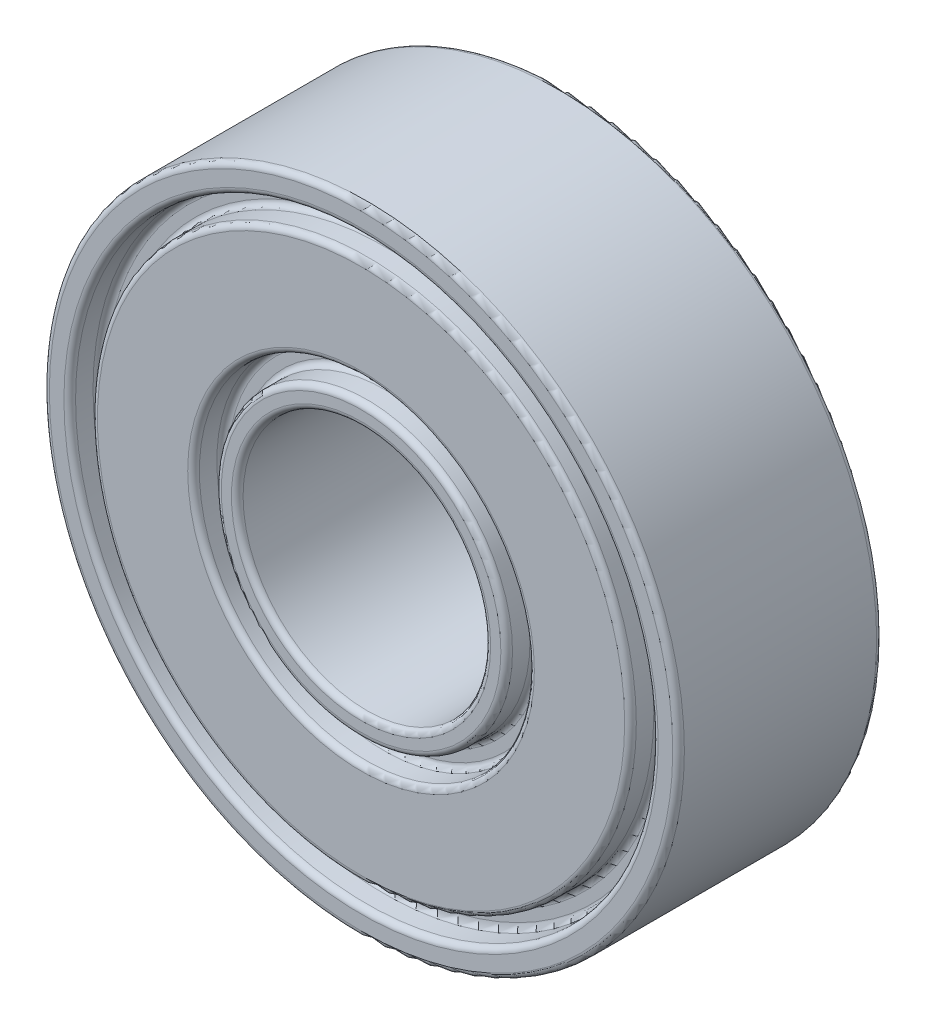
ISO-10303-21;
HEADER;
FILE_DESCRIPTION(('STEP AP214'),'2;1');
FILE_NAME('part.step','',(''),(''),'','','');
FILE_SCHEMA(('AUTOMOTIVE_DESIGN { 1 0 10303 214 1 1 1 1 }'));
ENDSEC;
DATA;
#1=APPLICATION_CONTEXT('core data for automotive mechanical design processes');
#2=APPLICATION_PROTOCOL_DEFINITION('international standard','automotive_design',2000,#1);
#3=PRODUCT_CONTEXT('',#1,'mechanical');
#4=PRODUCT('Part','Part','',(#3));
#5=PRODUCT_RELATED_PRODUCT_CATEGORY('part','',(#4));
#6=PRODUCT_DEFINITION_FORMATION('','',#4);
#7=PRODUCT_DEFINITION_CONTEXT('part definition',#1,'design');
#8=PRODUCT_DEFINITION('design','',#6,#7);
#9=PRODUCT_DEFINITION_SHAPE('','',#8);
#10=(LENGTH_UNIT() NAMED_UNIT(*) SI_UNIT(.MILLI.,.METRE.));
#11=(NAMED_UNIT(*) PLANE_ANGLE_UNIT() SI_UNIT($,.RADIAN.));
#12=(NAMED_UNIT(*) SI_UNIT($,.STERADIAN.) SOLID_ANGLE_UNIT());
#13=UNCERTAINTY_MEASURE_WITH_UNIT(LENGTH_MEASURE(1.E-05),#10,'distance_accuracy_value','');
#14=(GEOMETRIC_REPRESENTATION_CONTEXT(3) GLOBAL_UNCERTAINTY_ASSIGNED_CONTEXT((#13)) GLOBAL_UNIT_ASSIGNED_CONTEXT((#10,
#11,#12)) REPRESENTATION_CONTEXT('',''));
#15=CARTESIAN_POINT('',(0.,0.,0.));
#16=DIRECTION('',(0.,0.,1.));
#17=DIRECTION('',(1.,0.,0.));
#18=AXIS2_PLACEMENT_3D('',#15,#16,#17);
#19=CARTESIAN_POINT('',(0.,0.,7.));
#20=DIRECTION('',(0.,0.,1.));
#21=DIRECTION('',(1.,0.,0.));
#22=AXIS2_PLACEMENT_3D('',#19,#20,#21);
#23=PLANE('',#22);
#24=CARTESIAN_POINT('',(0.,0.,7.));
#25=DIRECTION('',(0.,0.,1.));
#26=DIRECTION('',(1.,0.,0.));
#27=AXIS2_PLACEMENT_3D('',#24,#25,#26);
#28=CIRCLE('',#27,4.8);
#29=CARTESIAN_POINT('',(4.8,0.,7.));
#30=VERTEX_POINT('',#29);
#31=EDGE_CURVE('E157',#30,#30,#28,.T.);
#32=ORIENTED_EDGE('',*,*,#31,.T.);
#33=EDGE_LOOP('',(#32));
#34=FACE_BOUND('',#33,.T.);
#35=CARTESIAN_POINT('',(0.,0.,7.));
#36=DIRECTION('',(0.,0.,1.));
#37=DIRECTION('',(1.,0.,0.));
#38=AXIS2_PLACEMENT_3D('',#35,#36,#37);
#39=CIRCLE('',#38,4.45);
#40=CARTESIAN_POINT('',(4.45,0.,7.));
#41=VERTEX_POINT('',#40);
#42=EDGE_CURVE('E161',#41,#41,#39,.F.);
#43=ORIENTED_EDGE('',*,*,#42,.T.);
#44=EDGE_LOOP('',(#43));
#45=FACE_BOUND('',#44,.T.);
#46=ADVANCED_FACE('F85',(#34,#45),#23,.T.);
#47=CARTESIAN_POINT('',(0.,0.,0.));
#48=DIRECTION('',(0.,0.,1.));
#49=DIRECTION('',(1.,0.,0.));
#50=AXIS2_PLACEMENT_3D('',#47,#48,#49);
#51=PLANE('',#50);
#52=CARTESIAN_POINT('',(0.,0.,0.));
#53=DIRECTION('',(0.,0.,1.));
#54=DIRECTION('',(1.,0.,0.));
#55=AXIS2_PLACEMENT_3D('',#52,#53,#54);
#56=CIRCLE('',#55,4.8);
#57=CARTESIAN_POINT('',(4.8,0.,0.));
#58=VERTEX_POINT('',#57);
#59=EDGE_CURVE('E173',#58,#58,#56,.F.);
#60=ORIENTED_EDGE('',*,*,#59,.T.);
#61=EDGE_LOOP('',(#60));
#62=FACE_BOUND('',#61,.T.);
#63=CARTESIAN_POINT('',(0.,0.,0.));
#64=DIRECTION('',(0.,0.,1.));
#65=DIRECTION('',(1.,0.,0.));
#66=AXIS2_PLACEMENT_3D('',#63,#64,#65);
#67=CIRCLE('',#66,4.45);
#68=CARTESIAN_POINT('',(4.45,0.,0.));
#69=VERTEX_POINT('',#68);
#70=EDGE_CURVE('E177',#69,#69,#67,.T.);
#71=ORIENTED_EDGE('',*,*,#70,.T.);
#72=EDGE_LOOP('',(#71));
#73=FACE_BOUND('',#72,.T.);
#74=ADVANCED_FACE('F322',(#62,#73),#51,.F.);
#75=CARTESIAN_POINT('',(0.,0.,7.));
#76=DIRECTION('',(0.,0.,-1.));
#77=DIRECTION('',(-1.,0.,0.));
#78=AXIS2_PLACEMENT_3D('',#75,#76,#77);
#79=CYLINDRICAL_SURFACE('',#78,10.9);
#80=CARTESIAN_POINT('',(0.,0.,0.2));
#81=DIRECTION('',(0.,0.,1.));
#82=DIRECTION('',(1.,0.,0.));
#83=AXIS2_PLACEMENT_3D('',#80,#81,#82);
#84=CIRCLE('',#83,10.9);
#85=CARTESIAN_POINT('',(10.9,0.,0.2));
#86=VERTEX_POINT('',#85);
#87=EDGE_CURVE('E245',#86,#86,#84,.T.);
#88=ORIENTED_EDGE('',*,*,#87,.T.);
#89=EDGE_LOOP('',(#88));
#90=FACE_BOUND('',#89,.T.);
#91=CARTESIAN_POINT('',(0.,0.,6.8));
#92=DIRECTION('',(0.,0.,1.));
#93=DIRECTION('',(1.,0.,0.));
#94=AXIS2_PLACEMENT_3D('',#91,#92,#93);
#95=CIRCLE('',#94,10.9);
#96=CARTESIAN_POINT('',(10.9,0.,6.8));
#97=VERTEX_POINT('',#96);
#98=EDGE_CURVE('E249',#97,#97,#95,.F.);
#99=ORIENTED_EDGE('',*,*,#98,.T.);
#100=EDGE_LOOP('',(#99));
#101=FACE_BOUND('',#100,.T.);
#102=ADVANCED_FACE('F254',(#90,#101),#79,.T.);
#103=CARTESIAN_POINT('',(0.,0.,7.));
#104=DIRECTION('',(0.,0.,1.));
#105=DIRECTION('',(1.,0.,0.));
#106=AXIS2_PLACEMENT_3D('',#103,#104,#105);
#107=CIRCLE('',#106,10.7);
#108=CARTESIAN_POINT('',(10.7,0.,7.));
#109=VERTEX_POINT('',#108);
#110=EDGE_CURVE('E141',#109,#109,#107,.T.);
#111=ORIENTED_EDGE('',*,*,#110,.T.);
#112=EDGE_LOOP('',(#111));
#113=FACE_BOUND('',#112,.T.);
#114=CARTESIAN_POINT('',(0.,0.,7.));
#115=DIRECTION('',(0.,0.,1.));
#116=DIRECTION('',(1.,0.,0.));
#117=AXIS2_PLACEMENT_3D('',#114,#115,#116);
#118=CIRCLE('',#117,10.2);
#119=CARTESIAN_POINT('',(10.2,0.,7.));
#120=VERTEX_POINT('',#119);
#121=EDGE_CURVE('E145',#120,#120,#118,.F.);
#122=ORIENTED_EDGE('',*,*,#121,.T.);
#123=EDGE_LOOP('',(#122));
#124=FACE_BOUND('',#123,.T.);
#125=ADVANCED_FACE('F264',(#113,#124),#23,.T.);
#126=CARTESIAN_POINT('',(0.,0.,0.));
#127=DIRECTION('',(0.,0.,1.));
#128=DIRECTION('',(1.,0.,0.));
#129=AXIS2_PLACEMENT_3D('',#126,#127,#128);
#130=CIRCLE('',#129,10.7);
#131=CARTESIAN_POINT('',(10.7,0.,0.));
#132=VERTEX_POINT('',#131);
#133=EDGE_CURVE('E237',#132,#132,#130,.F.);
#134=ORIENTED_EDGE('',*,*,#133,.T.);
#135=EDGE_LOOP('',(#134));
#136=FACE_BOUND('',#135,.T.);
#137=CARTESIAN_POINT('',(0.,0.,0.));
#138=DIRECTION('',(0.,0.,1.));
#139=DIRECTION('',(1.,0.,0.));
#140=AXIS2_PLACEMENT_3D('',#137,#138,#139);
#141=CIRCLE('',#140,10.2);
#142=CARTESIAN_POINT('',(10.2,0.,0.));
#143=VERTEX_POINT('',#142);
#144=EDGE_CURVE('E241',#143,#143,#141,.T.);
#145=ORIENTED_EDGE('',*,*,#144,.T.);
#146=EDGE_LOOP('',(#145));
#147=FACE_BOUND('',#146,.T.);
#148=ADVANCED_FACE('F267',(#136,#147),#51,.F.);
#149=CARTESIAN_POINT('',(0.,0.,7.));
#150=DIRECTION('',(0.,0.,-1.));
#151=DIRECTION('',(-1.,0.,0.));
#152=AXIS2_PLACEMENT_3D('',#149,#150,#151);
#153=CYLINDRICAL_SURFACE('',#152,4.25);
#154=CARTESIAN_POINT('',(0.,0.,0.2));
#155=DIRECTION('',(0.,0.,1.));
#156=DIRECTION('',(1.,0.,0.));
#157=AXIS2_PLACEMENT_3D('',#154,#155,#156);
#158=CIRCLE('',#157,4.25);
#159=CARTESIAN_POINT('',(4.25,0.,0.2));
#160=VERTEX_POINT('',#159);
#161=EDGE_CURVE('E165',#160,#160,#158,.F.);
#162=ORIENTED_EDGE('',*,*,#161,.T.);
#163=EDGE_LOOP('',(#162));
#164=FACE_BOUND('',#163,.T.);
#165=CARTESIAN_POINT('',(0.,0.,6.8));
#166=DIRECTION('',(0.,0.,1.));
#167=DIRECTION('',(1.,0.,0.));
#168=AXIS2_PLACEMENT_3D('',#165,#166,#167);
#169=CIRCLE('',#168,4.25);
#170=CARTESIAN_POINT('',(4.25,0.,6.8));
#171=VERTEX_POINT('',#170);
#172=EDGE_CURVE('E169',#171,#171,#169,.T.);
#173=ORIENTED_EDGE('',*,*,#172,.T.);
#174=EDGE_LOOP('',(#173));
#175=FACE_BOUND('',#174,.T.);
#176=ADVANCED_FACE('F376',(#164,#175),#153,.F.);
#177=CARTESIAN_POINT('',(0.,0.,1.));
#178=DIRECTION('',(0.,0.,-1.));
#179=DIRECTION('',(-1.,0.,0.));
#180=AXIS2_PLACEMENT_3D('',#177,#178,#179);
#181=CYLINDRICAL_SURFACE('',#180,5.);
#182=CARTESIAN_POINT('',(0.,0.,0.8));
#183=DIRECTION('',(0.,0.,1.));
#184=DIRECTION('',(1.,0.,0.));
#185=AXIS2_PLACEMENT_3D('',#182,#183,#184);
#186=CIRCLE('',#185,5.);
#187=CARTESIAN_POINT('',(5.,0.,0.8));
#188=VERTEX_POINT('',#187);
#189=EDGE_CURVE('E181',#188,#188,#186,.F.);
#190=ORIENTED_EDGE('',*,*,#189,.T.);
#191=EDGE_LOOP('',(#190));
#192=FACE_BOUND('',#191,.T.);
#193=CARTESIAN_POINT('',(0.,0.,0.2));
#194=DIRECTION('',(0.,0.,1.));
#195=DIRECTION('',(1.,0.,0.));
#196=AXIS2_PLACEMENT_3D('',#193,#194,#195);
#197=CIRCLE('',#196,5.);
#198=CARTESIAN_POINT('',(5.,0.,0.2));
#199=VERTEX_POINT('',#198);
#200=EDGE_CURVE('E185',#199,#199,#197,.T.);
#201=ORIENTED_EDGE('',*,*,#200,.T.);
#202=EDGE_LOOP('',(#201));
#203=FACE_BOUND('',#202,.T.);
#204=ADVANCED_FACE('F373',(#192,#203),#181,.T.);
#205=CARTESIAN_POINT('',(0.,0.,1.));
#206=DIRECTION('',(0.,0.,-1.));
#207=DIRECTION('',(-1.,0.,0.));
#208=AXIS2_PLACEMENT_3D('',#205,#206,#207);
#209=CYLINDRICAL_SURFACE('',#208,5.75);
#210=CARTESIAN_POINT('',(0.,0.,0.2));
#211=DIRECTION('',(0.,0.,1.));
#212=DIRECTION('',(1.,0.,0.));
#213=AXIS2_PLACEMENT_3D('',#210,#211,#212);
#214=CIRCLE('',#213,5.75);
#215=CARTESIAN_POINT('',(5.75,0.,0.2));
#216=VERTEX_POINT('',#215);
#217=EDGE_CURVE('E197',#216,#216,#214,.F.);
#218=ORIENTED_EDGE('',*,*,#217,.T.);
#219=EDGE_LOOP('',(#218));
#220=FACE_BOUND('',#219,.T.);
#221=CARTESIAN_POINT('',(0.,0.,0.8));
#222=DIRECTION('',(0.,0.,1.));
#223=DIRECTION('',(1.,0.,0.));
#224=AXIS2_PLACEMENT_3D('',#221,#222,#223);
#225=CIRCLE('',#224,5.75);
#226=CARTESIAN_POINT('',(5.75,0.,0.8));
#227=VERTEX_POINT('',#226);
#228=EDGE_CURVE('E201',#227,#227,#225,.T.);
#229=ORIENTED_EDGE('',*,*,#228,.T.);
#230=EDGE_LOOP('',(#229));
#231=FACE_BOUND('',#230,.T.);
#232=ADVANCED_FACE('F369',(#220,#231),#209,.F.);
#233=CARTESIAN_POINT('',(0.,0.,1.));
#234=DIRECTION('',(0.,0.,1.));
#235=DIRECTION('',(1.,0.,0.));
#236=AXIS2_PLACEMENT_3D('',#233,#234,#235);
#237=PLANE('',#236);
#238=CARTESIAN_POINT('',(0.,0.,1.));
#239=DIRECTION('',(0.,0.,1.));
#240=DIRECTION('',(1.,0.,0.));
#241=AXIS2_PLACEMENT_3D('',#238,#239,#240);
#242=CIRCLE('',#241,5.55);
#243=CARTESIAN_POINT('',(5.55,0.,1.));
#244=VERTEX_POINT('',#243);
#245=EDGE_CURVE('E189',#244,#244,#242,.F.);
#246=ORIENTED_EDGE('',*,*,#245,.T.);
#247=EDGE_LOOP('',(#246));
#248=FACE_BOUND('',#247,.T.);
#249=CARTESIAN_POINT('',(0.,0.,1.));
#250=DIRECTION('',(0.,0.,1.));
#251=DIRECTION('',(1.,0.,0.));
#252=AXIS2_PLACEMENT_3D('',#249,#250,#251);
#253=CIRCLE('',#252,5.2);
#254=CARTESIAN_POINT('',(5.2,0.,1.));
#255=VERTEX_POINT('',#254);
#256=EDGE_CURVE('E193',#255,#255,#253,.T.);
#257=ORIENTED_EDGE('',*,*,#256,.T.);
#258=EDGE_LOOP('',(#257));
#259=FACE_BOUND('',#258,.T.);
#260=ADVANCED_FACE('F365',(#248,#259),#237,.F.);
#261=CARTESIAN_POINT('',(0.,0.,1.));
#262=DIRECTION('',(0.,0.,-1.));
#263=DIRECTION('',(-1.,0.,0.));
#264=AXIS2_PLACEMENT_3D('',#261,#262,#263);
#265=CYLINDRICAL_SURFACE('',#264,9.25);
#266=CARTESIAN_POINT('',(0.,0.,0.8));
#267=DIRECTION('',(0.,0.,1.));
#268=DIRECTION('',(1.,0.,0.));
#269=AXIS2_PLACEMENT_3D('',#266,#267,#268);
#270=CIRCLE('',#269,9.25);
#271=CARTESIAN_POINT('',(9.25,0.,0.8));
#272=VERTEX_POINT('',#271);
#273=EDGE_CURVE('E213',#272,#272,#270,.F.);
#274=ORIENTED_EDGE('',*,*,#273,.T.);
#275=EDGE_LOOP('',(#274));
#276=FACE_BOUND('',#275,.T.);
#277=CARTESIAN_POINT('',(0.,0.,0.2));
#278=DIRECTION('',(0.,0.,1.));
#279=DIRECTION('',(1.,0.,0.));
#280=AXIS2_PLACEMENT_3D('',#277,#278,#279);
#281=CIRCLE('',#280,9.25);
#282=CARTESIAN_POINT('',(9.25,0.,0.2));
#283=VERTEX_POINT('',#282);
#284=EDGE_CURVE('E217',#283,#283,#281,.T.);
#285=ORIENTED_EDGE('',*,*,#284,.T.);
#286=EDGE_LOOP('',(#285));
#287=FACE_BOUND('',#286,.T.);
#288=ADVANCED_FACE('F361',(#276,#287),#265,.T.);
#289=CARTESIAN_POINT('',(0.,0.,1.));
#290=DIRECTION('',(0.,0.,-1.));
#291=DIRECTION('',(-1.,0.,0.));
#292=AXIS2_PLACEMENT_3D('',#289,#290,#291);
#293=CYLINDRICAL_SURFACE('',#292,10.);
#294=CARTESIAN_POINT('',(0.,0.,0.2));
#295=DIRECTION('',(0.,0.,1.));
#296=DIRECTION('',(1.,0.,0.));
#297=AXIS2_PLACEMENT_3D('',#294,#295,#296);
#298=CIRCLE('',#297,10.);
#299=CARTESIAN_POINT('',(10.,0.,0.2));
#300=VERTEX_POINT('',#299);
#301=EDGE_CURVE('E229',#300,#300,#298,.F.);
#302=ORIENTED_EDGE('',*,*,#301,.T.);
#303=EDGE_LOOP('',(#302));
#304=FACE_BOUND('',#303,.T.);
#305=CARTESIAN_POINT('',(0.,0.,0.8));
#306=DIRECTION('',(0.,0.,1.));
#307=DIRECTION('',(1.,0.,0.));
#308=AXIS2_PLACEMENT_3D('',#305,#306,#307);
#309=CIRCLE('',#308,10.);
#310=CARTESIAN_POINT('',(10.,0.,0.8));
#311=VERTEX_POINT('',#310);
#312=EDGE_CURVE('E233',#311,#311,#309,.T.);
#313=ORIENTED_EDGE('',*,*,#312,.T.);
#314=EDGE_LOOP('',(#313));
#315=FACE_BOUND('',#314,.T.);
#316=ADVANCED_FACE('F357',(#304,#315),#293,.F.);
#317=CARTESIAN_POINT('',(0.,0.,1.));
#318=DIRECTION('',(0.,0.,1.));
#319=DIRECTION('',(1.,0.,0.));
#320=AXIS2_PLACEMENT_3D('',#317,#318,#319);
#321=PLANE('',#320);
#322=CARTESIAN_POINT('',(0.,0.,1.));
#323=DIRECTION('',(0.,0.,1.));
#324=DIRECTION('',(1.,0.,0.));
#325=AXIS2_PLACEMENT_3D('',#322,#323,#324);
#326=CIRCLE('',#325,9.8);
#327=CARTESIAN_POINT('',(9.8,0.,1.));
#328=VERTEX_POINT('',#327);
#329=EDGE_CURVE('E221',#328,#328,#326,.F.);
#330=ORIENTED_EDGE('',*,*,#329,.T.);
#331=EDGE_LOOP('',(#330));
#332=FACE_BOUND('',#331,.T.);
#333=CARTESIAN_POINT('',(0.,0.,1.));
#334=DIRECTION('',(0.,0.,1.));
#335=DIRECTION('',(1.,0.,0.));
#336=AXIS2_PLACEMENT_3D('',#333,#334,#335);
#337=CIRCLE('',#336,9.45);
#338=CARTESIAN_POINT('',(9.45,0.,1.));
#339=VERTEX_POINT('',#338);
#340=EDGE_CURVE('E225',#339,#339,#337,.T.);
#341=ORIENTED_EDGE('',*,*,#340,.T.);
#342=EDGE_LOOP('',(#341));
#343=FACE_BOUND('',#342,.T.);
#344=ADVANCED_FACE('F354',(#332,#343),#321,.F.);
#345=CARTESIAN_POINT('',(0.,0.,0.));
#346=DIRECTION('',(0.,0.,1.));
#347=DIRECTION('',(1.,0.,0.));
#348=AXIS2_PLACEMENT_3D('',#345,#346,#347);
#349=CIRCLE('',#348,9.05);
#350=CARTESIAN_POINT('',(9.05,0.,0.));
#351=VERTEX_POINT('',#350);
#352=EDGE_CURVE('E205',#351,#351,#349,.F.);
#353=ORIENTED_EDGE('',*,*,#352,.T.);
#354=EDGE_LOOP('',(#353));
#355=FACE_BOUND('',#354,.T.);
#356=CARTESIAN_POINT('',(0.,0.,0.));
#357=DIRECTION('',(0.,0.,1.));
#358=DIRECTION('',(1.,0.,0.));
#359=AXIS2_PLACEMENT_3D('',#356,#357,#358);
#360=CIRCLE('',#359,5.95);
#361=CARTESIAN_POINT('',(5.95,0.,0.));
#362=VERTEX_POINT('',#361);
#363=EDGE_CURVE('E209',#362,#362,#360,.T.);
#364=ORIENTED_EDGE('',*,*,#363,.T.);
#365=EDGE_LOOP('',(#364));
#366=FACE_BOUND('',#365,.T.);
#367=ADVANCED_FACE('F282',(#355,#366),#51,.F.);
#368=CARTESIAN_POINT('',(0.,0.,6.));
#369=DIRECTION('',(0.,0.,1.));
#370=DIRECTION('',(1.,0.,0.));
#371=AXIS2_PLACEMENT_3D('',#368,#369,#370);
#372=CYLINDRICAL_SURFACE('',#371,10.);
#373=CARTESIAN_POINT('',(0.,0.,6.8));
#374=DIRECTION('',(0.,0.,1.));
#375=DIRECTION('',(1.,0.,0.));
#376=AXIS2_PLACEMENT_3D('',#373,#374,#375);
#377=CIRCLE('',#376,10.);
#378=CARTESIAN_POINT('',(10.,0.,6.8));
#379=VERTEX_POINT('',#378);
#380=EDGE_CURVE('E133',#379,#379,#377,.T.);
#381=ORIENTED_EDGE('',*,*,#380,.T.);
#382=EDGE_LOOP('',(#381));
#383=FACE_BOUND('',#382,.T.);
#384=CARTESIAN_POINT('',(0.,0.,6.2));
#385=DIRECTION('',(0.,0.,1.));
#386=DIRECTION('',(1.,0.,0.));
#387=AXIS2_PLACEMENT_3D('',#384,#385,#386);
#388=CIRCLE('',#387,10.);
#389=CARTESIAN_POINT('',(10.,0.,6.2));
#390=VERTEX_POINT('',#389);
#391=EDGE_CURVE('E137',#390,#390,#388,.F.);
#392=ORIENTED_EDGE('',*,*,#391,.T.);
#393=EDGE_LOOP('',(#392));
#394=FACE_BOUND('',#393,.T.);
#395=ADVANCED_FACE('F278',(#383,#394),#372,.F.);
#396=CARTESIAN_POINT('',(0.,0.,6.));
#397=DIRECTION('',(0.,0.,1.));
#398=DIRECTION('',(1.,0.,0.));
#399=AXIS2_PLACEMENT_3D('',#396,#397,#398);
#400=PLANE('',#399);
#401=CARTESIAN_POINT('',(0.,0.,6.));
#402=DIRECTION('',(0.,0.,1.));
#403=DIRECTION('',(1.,0.,0.));
#404=AXIS2_PLACEMENT_3D('',#401,#402,#403);
#405=CIRCLE('',#404,9.8);
#406=CARTESIAN_POINT('',(9.8,0.,6.));
#407=VERTEX_POINT('',#406);
#408=EDGE_CURVE('E125',#407,#407,#405,.T.);
#409=ORIENTED_EDGE('',*,*,#408,.T.);
#410=EDGE_LOOP('',(#409));
#411=FACE_BOUND('',#410,.T.);
#412=CARTESIAN_POINT('',(0.,0.,6.));
#413=DIRECTION('',(0.,0.,1.));
#414=DIRECTION('',(1.,0.,0.));
#415=AXIS2_PLACEMENT_3D('',#412,#413,#414);
#416=CIRCLE('',#415,9.45);
#417=CARTESIAN_POINT('',(9.45,0.,6.));
#418=VERTEX_POINT('',#417);
#419=EDGE_CURVE('E129',#418,#418,#416,.F.);
#420=ORIENTED_EDGE('',*,*,#419,.T.);
#421=EDGE_LOOP('',(#420));
#422=FACE_BOUND('',#421,.T.);
#423=ADVANCED_FACE('F281',(#411,#422),#400,.T.);
#424=CARTESIAN_POINT('',(0.,0.,6.));
#425=DIRECTION('',(0.,0.,1.));
#426=DIRECTION('',(1.,0.,0.));
#427=AXIS2_PLACEMENT_3D('',#424,#425,#426);
#428=CYLINDRICAL_SURFACE('',#427,9.25);
#429=CARTESIAN_POINT('',(0.,0.,6.2));
#430=DIRECTION('',(0.,0.,1.));
#431=DIRECTION('',(1.,0.,0.));
#432=AXIS2_PLACEMENT_3D('',#429,#430,#431);
#433=CIRCLE('',#432,9.25);
#434=CARTESIAN_POINT('',(9.25,0.,6.2));
#435=VERTEX_POINT('',#434);
#436=EDGE_CURVE('E117',#435,#435,#433,.T.);
#437=ORIENTED_EDGE('',*,*,#436,.T.);
#438=EDGE_LOOP('',(#437));
#439=FACE_BOUND('',#438,.T.);
#440=CARTESIAN_POINT('',(0.,0.,6.8));
#441=DIRECTION('',(0.,0.,1.));
#442=DIRECTION('',(1.,0.,0.));
#443=AXIS2_PLACEMENT_3D('',#440,#441,#442);
#444=CIRCLE('',#443,9.25);
#445=CARTESIAN_POINT('',(9.25,0.,6.8));
#446=VERTEX_POINT('',#445);
#447=EDGE_CURVE('E121',#446,#446,#444,.F.);
#448=ORIENTED_EDGE('',*,*,#447,.T.);
#449=EDGE_LOOP('',(#448));
#450=FACE_BOUND('',#449,.T.);
#451=ADVANCED_FACE('F294',(#439,#450),#428,.T.);
#452=CARTESIAN_POINT('',(0.,0.,6.));
#453=DIRECTION('',(0.,0.,1.));
#454=DIRECTION('',(1.,0.,0.));
#455=AXIS2_PLACEMENT_3D('',#452,#453,#454);
#456=CYLINDRICAL_SURFACE('',#455,5.75);
#457=CARTESIAN_POINT('',(0.,0.,6.2));
#458=DIRECTION('',(0.,0.,1.));
#459=DIRECTION('',(1.,0.,0.));
#460=AXIS2_PLACEMENT_3D('',#457,#458,#459);
#461=CIRCLE('',#460,5.75);
#462=CARTESIAN_POINT('',(5.75,0.,6.2));
#463=VERTEX_POINT('',#462);
#464=EDGE_CURVE('E98',#463,#463,#461,.F.);
#465=ORIENTED_EDGE('',*,*,#464,.T.);
#466=EDGE_LOOP('',(#465));
#467=FACE_BOUND('',#466,.T.);
#468=CARTESIAN_POINT('',(0.,0.,6.8));
#469=DIRECTION('',(0.,0.,1.));
#470=DIRECTION('',(1.,0.,0.));
#471=AXIS2_PLACEMENT_3D('',#468,#469,#470);
#472=CIRCLE('',#471,5.75);
#473=CARTESIAN_POINT('',(5.75,0.,6.8));
#474=VERTEX_POINT('',#473);
#475=EDGE_CURVE('E103',#474,#474,#472,.T.);
#476=ORIENTED_EDGE('',*,*,#475,.T.);
#477=EDGE_LOOP('',(#476));
#478=FACE_BOUND('',#477,.T.);
#479=ADVANCED_FACE('F306',(#467,#478),#456,.F.);
#480=CARTESIAN_POINT('',(0.,0.,6.));
#481=DIRECTION('',(0.,0.,1.));
#482=DIRECTION('',(1.,0.,0.));
#483=AXIS2_PLACEMENT_3D('',#480,#481,#482);
#484=PLANE('',#483);
#485=CARTESIAN_POINT('',(0.,0.,6.));
#486=DIRECTION('',(0.,0.,1.));
#487=DIRECTION('',(1.,0.,0.));
#488=AXIS2_PLACEMENT_3D('',#485,#486,#487);
#489=CIRCLE('',#488,5.55);
#490=CARTESIAN_POINT('',(5.55,0.,6.));
#491=VERTEX_POINT('',#490);
#492=EDGE_CURVE('E109',#491,#491,#489,.T.);
#493=ORIENTED_EDGE('',*,*,#492,.T.);
#494=EDGE_LOOP('',(#493));
#495=FACE_BOUND('',#494,.T.);
#496=CARTESIAN_POINT('',(0.,0.,6.));
#497=DIRECTION('',(0.,0.,1.));
#498=DIRECTION('',(1.,0.,0.));
#499=AXIS2_PLACEMENT_3D('',#496,#497,#498);
#500=CIRCLE('',#499,5.2);
#501=CARTESIAN_POINT('',(5.2,0.,6.));
#502=VERTEX_POINT('',#501);
#503=EDGE_CURVE('E113',#502,#502,#500,.F.);
#504=ORIENTED_EDGE('',*,*,#503,.T.);
#505=EDGE_LOOP('',(#504));
#506=FACE_BOUND('',#505,.T.);
#507=ADVANCED_FACE('F341',(#495,#506),#484,.T.);
#508=CARTESIAN_POINT('',(0.,0.,6.));
#509=DIRECTION('',(0.,0.,1.));
#510=DIRECTION('',(1.,0.,0.));
#511=AXIS2_PLACEMENT_3D('',#508,#509,#510);
#512=CYLINDRICAL_SURFACE('',#511,5.);
#513=CARTESIAN_POINT('',(0.,0.,6.8));
#514=DIRECTION('',(0.,0.,1.));
#515=DIRECTION('',(1.,0.,0.));
#516=AXIS2_PLACEMENT_3D('',#513,#514,#515);
#517=CIRCLE('',#516,5.);
#518=CARTESIAN_POINT('',(5.,0.,6.8));
#519=VERTEX_POINT('',#518);
#520=EDGE_CURVE('E149',#519,#519,#517,.F.);
#521=ORIENTED_EDGE('',*,*,#520,.T.);
#522=EDGE_LOOP('',(#521));
#523=FACE_BOUND('',#522,.T.);
#524=CARTESIAN_POINT('',(0.,0.,6.2));
#525=DIRECTION('',(0.,0.,1.));
#526=DIRECTION('',(1.,0.,0.));
#527=AXIS2_PLACEMENT_3D('',#524,#525,#526);
#528=CIRCLE('',#527,5.);
#529=CARTESIAN_POINT('',(5.,0.,6.2));
#530=VERTEX_POINT('',#529);
#531=EDGE_CURVE('E153',#530,#530,#528,.T.);
#532=ORIENTED_EDGE('',*,*,#531,.T.);
#533=EDGE_LOOP('',(#532));
#534=FACE_BOUND('',#533,.T.);
#535=ADVANCED_FACE('F333',(#523,#534),#512,.T.);
#536=CARTESIAN_POINT('',(0.,0.,7.));
#537=DIRECTION('',(0.,0.,1.));
#538=DIRECTION('',(1.,0.,0.));
#539=AXIS2_PLACEMENT_3D('',#536,#537,#538);
#540=CIRCLE('',#539,9.05);
#541=CARTESIAN_POINT('',(9.05,0.,7.));
#542=VERTEX_POINT('',#541);
#543=EDGE_CURVE('E11',#542,#542,#540,.T.);
#544=ORIENTED_EDGE('',*,*,#543,.T.);
#545=EDGE_LOOP('',(#544));
#546=FACE_BOUND('',#545,.T.);
#547=CARTESIAN_POINT('',(0.,0.,7.));
#548=DIRECTION('',(0.,0.,1.));
#549=DIRECTION('',(1.,0.,0.));
#550=AXIS2_PLACEMENT_3D('',#547,#548,#549);
#551=CIRCLE('',#550,5.95);
#552=CARTESIAN_POINT('',(5.95,0.,7.));
#553=VERTEX_POINT('',#552);
#554=EDGE_CURVE('E93',#553,#553,#551,.F.);
#555=ORIENTED_EDGE('',*,*,#554,.T.);
#556=EDGE_LOOP('',(#555));
#557=FACE_BOUND('',#556,.T.);
#558=ADVANCED_FACE('F269',(#546,#557),#23,.T.);
#559=CARTESIAN_POINT('',(0.,0.,0.2));
#560=DIRECTION('',(0.,0.,1.));
#561=DIRECTION('',(1.,0.,0.));
#562=AXIS2_PLACEMENT_3D('',#559,#560,#561);
#563=TOROIDAL_SURFACE('',#562,10.7,0.2);
#564=ORIENTED_EDGE('',*,*,#133,.F.);
#565=EDGE_LOOP('',(#564));
#566=FACE_BOUND('',#565,.T.);
#567=ORIENTED_EDGE('',*,*,#87,.F.);
#568=EDGE_LOOP('',(#567));
#569=FACE_BOUND('',#568,.T.);
#570=ADVANCED_FACE('F332',(#566,#569),#563,.T.);
#571=CARTESIAN_POINT('',(0.,0.,0.2));
#572=DIRECTION('',(0.,0.,1.));
#573=DIRECTION('',(1.,0.,0.));
#574=AXIS2_PLACEMENT_3D('',#571,#572,#573);
#575=TOROIDAL_SURFACE('',#574,10.2,0.2);
#576=ORIENTED_EDGE('',*,*,#301,.F.);
#577=EDGE_LOOP('',(#576));
#578=FACE_BOUND('',#577,.T.);
#579=ORIENTED_EDGE('',*,*,#144,.F.);
#580=EDGE_LOOP('',(#579));
#581=FACE_BOUND('',#580,.T.);
#582=ADVANCED_FACE('F338',(#578,#581),#575,.T.);
#583=CARTESIAN_POINT('',(0.,0.,0.8));
#584=DIRECTION('',(0.,0.,1.));
#585=DIRECTION('',(1.,0.,0.));
#586=AXIS2_PLACEMENT_3D('',#583,#584,#585);
#587=TOROIDAL_SURFACE('',#586,9.8,0.2);
#588=ORIENTED_EDGE('',*,*,#329,.F.);
#589=EDGE_LOOP('',(#588));
#590=FACE_BOUND('',#589,.T.);
#591=ORIENTED_EDGE('',*,*,#312,.F.);
#592=EDGE_LOOP('',(#591));
#593=FACE_BOUND('',#592,.T.);
#594=ADVANCED_FACE('F543',(#590,#593),#587,.F.);
#595=CARTESIAN_POINT('',(0.,0.,0.8));
#596=DIRECTION('',(0.,0.,1.));
#597=DIRECTION('',(1.,0.,0.));
#598=AXIS2_PLACEMENT_3D('',#595,#596,#597);
#599=TOROIDAL_SURFACE('',#598,9.45,0.2);
#600=ORIENTED_EDGE('',*,*,#273,.F.);
#601=EDGE_LOOP('',(#600));
#602=FACE_BOUND('',#601,.T.);
#603=ORIENTED_EDGE('',*,*,#340,.F.);
#604=EDGE_LOOP('',(#603));
#605=FACE_BOUND('',#604,.T.);
#606=ADVANCED_FACE('F533',(#602,#605),#599,.F.);
#607=CARTESIAN_POINT('',(0.,0.,0.2));
#608=DIRECTION('',(0.,0.,1.));
#609=DIRECTION('',(1.,0.,0.));
#610=AXIS2_PLACEMENT_3D('',#607,#608,#609);
#611=TOROIDAL_SURFACE('',#610,9.05,0.2);
#612=ORIENTED_EDGE('',*,*,#352,.F.);
#613=EDGE_LOOP('',(#612));
#614=FACE_BOUND('',#613,.T.);
#615=ORIENTED_EDGE('',*,*,#284,.F.);
#616=EDGE_LOOP('',(#615));
#617=FACE_BOUND('',#616,.T.);
#618=ADVANCED_FACE('F523',(#614,#617),#611,.T.);
#619=CARTESIAN_POINT('',(0.,0.,0.2));
#620=DIRECTION('',(0.,0.,1.));
#621=DIRECTION('',(1.,0.,0.));
#622=AXIS2_PLACEMENT_3D('',#619,#620,#621);
#623=TOROIDAL_SURFACE('',#622,5.95,0.2);
#624=ORIENTED_EDGE('',*,*,#217,.F.);
#625=EDGE_LOOP('',(#624));
#626=FACE_BOUND('',#625,.T.);
#627=ORIENTED_EDGE('',*,*,#363,.F.);
#628=EDGE_LOOP('',(#627));
#629=FACE_BOUND('',#628,.T.);
#630=ADVANCED_FACE('F513',(#626,#629),#623,.T.);
#631=CARTESIAN_POINT('',(0.,0.,0.8));
#632=DIRECTION('',(0.,0.,1.));
#633=DIRECTION('',(1.,0.,0.));
#634=AXIS2_PLACEMENT_3D('',#631,#632,#633);
#635=TOROIDAL_SURFACE('',#634,5.55,0.2);
#636=ORIENTED_EDGE('',*,*,#245,.F.);
#637=EDGE_LOOP('',(#636));
#638=FACE_BOUND('',#637,.T.);
#639=ORIENTED_EDGE('',*,*,#228,.F.);
#640=EDGE_LOOP('',(#639));
#641=FACE_BOUND('',#640,.T.);
#642=ADVANCED_FACE('F503',(#638,#641),#635,.F.);
#643=CARTESIAN_POINT('',(0.,0.,0.8));
#644=DIRECTION('',(0.,0.,1.));
#645=DIRECTION('',(1.,0.,0.));
#646=AXIS2_PLACEMENT_3D('',#643,#644,#645);
#647=TOROIDAL_SURFACE('',#646,5.2,0.2);
#648=ORIENTED_EDGE('',*,*,#189,.F.);
#649=EDGE_LOOP('',(#648));
#650=FACE_BOUND('',#649,.T.);
#651=ORIENTED_EDGE('',*,*,#256,.F.);
#652=EDGE_LOOP('',(#651));
#653=FACE_BOUND('',#652,.T.);
#654=ADVANCED_FACE('F493',(#650,#653),#647,.F.);
#655=CARTESIAN_POINT('',(0.,0.,0.2));
#656=DIRECTION('',(0.,0.,1.));
#657=DIRECTION('',(1.,0.,0.));
#658=AXIS2_PLACEMENT_3D('',#655,#656,#657);
#659=TOROIDAL_SURFACE('',#658,4.8,0.2);
#660=ORIENTED_EDGE('',*,*,#59,.F.);
#661=EDGE_LOOP('',(#660));
#662=FACE_BOUND('',#661,.T.);
#663=ORIENTED_EDGE('',*,*,#200,.F.);
#664=EDGE_LOOP('',(#663));
#665=FACE_BOUND('',#664,.T.);
#666=ADVANCED_FACE('F484',(#662,#665),#659,.T.);
#667=CARTESIAN_POINT('',(0.,0.,0.2));
#668=DIRECTION('',(0.,0.,1.));
#669=DIRECTION('',(1.,0.,0.));
#670=AXIS2_PLACEMENT_3D('',#667,#668,#669);
#671=TOROIDAL_SURFACE('',#670,4.45,0.2);
#672=ORIENTED_EDGE('',*,*,#161,.F.);
#673=EDGE_LOOP('',(#672));
#674=FACE_BOUND('',#673,.T.);
#675=ORIENTED_EDGE('',*,*,#70,.F.);
#676=EDGE_LOOP('',(#675));
#677=FACE_BOUND('',#676,.T.);
#678=ADVANCED_FACE('F395',(#674,#677),#671,.T.);
#679=CARTESIAN_POINT('',(0.,0.,6.8));
#680=DIRECTION('',(0.,0.,1.));
#681=DIRECTION('',(1.,0.,0.));
#682=AXIS2_PLACEMENT_3D('',#679,#680,#681);
#683=TOROIDAL_SURFACE('',#682,4.8,0.2);
#684=ORIENTED_EDGE('',*,*,#520,.F.);
#685=EDGE_LOOP('',(#684));
#686=FACE_BOUND('',#685,.T.);
#687=ORIENTED_EDGE('',*,*,#31,.F.);
#688=EDGE_LOOP('',(#687));
#689=FACE_BOUND('',#688,.T.);
#690=ADVANCED_FACE('F389',(#686,#689),#683,.T.);
#691=CARTESIAN_POINT('',(0.,0.,6.8));
#692=DIRECTION('',(0.,0.,1.));
#693=DIRECTION('',(1.,0.,0.));
#694=AXIS2_PLACEMENT_3D('',#691,#692,#693);
#695=TOROIDAL_SURFACE('',#694,4.45,0.2);
#696=ORIENTED_EDGE('',*,*,#42,.F.);
#697=EDGE_LOOP('',(#696));
#698=FACE_BOUND('',#697,.T.);
#699=ORIENTED_EDGE('',*,*,#172,.F.);
#700=EDGE_LOOP('',(#699));
#701=FACE_BOUND('',#700,.T.);
#702=ADVANCED_FACE('F260',(#698,#701),#695,.T.);
#703=CARTESIAN_POINT('',(0.,0.,6.8));
#704=DIRECTION('',(0.,0.,1.));
#705=DIRECTION('',(1.,0.,0.));
#706=AXIS2_PLACEMENT_3D('',#703,#704,#705);
#707=TOROIDAL_SURFACE('',#706,10.7,0.2);
#708=ORIENTED_EDGE('',*,*,#98,.F.);
#709=EDGE_LOOP('',(#708));
#710=FACE_BOUND('',#709,.T.);
#711=ORIENTED_EDGE('',*,*,#110,.F.);
#712=EDGE_LOOP('',(#711));
#713=FACE_BOUND('',#712,.T.);
#714=ADVANCED_FACE('F256',(#710,#713),#707,.T.);
#715=CARTESIAN_POINT('',(0.,0.,6.8));
#716=DIRECTION('',(0.,0.,1.));
#717=DIRECTION('',(1.,0.,0.));
#718=AXIS2_PLACEMENT_3D('',#715,#716,#717);
#719=TOROIDAL_SURFACE('',#718,10.2,0.2);
#720=ORIENTED_EDGE('',*,*,#121,.F.);
#721=EDGE_LOOP('',(#720));
#722=FACE_BOUND('',#721,.T.);
#723=ORIENTED_EDGE('',*,*,#380,.F.);
#724=EDGE_LOOP('',(#723));
#725=FACE_BOUND('',#724,.T.);
#726=ADVANCED_FACE('F259',(#722,#725),#719,.T.);
#727=CARTESIAN_POINT('',(0.,0.,6.2));
#728=DIRECTION('',(0.,0.,1.));
#729=DIRECTION('',(1.,0.,0.));
#730=AXIS2_PLACEMENT_3D('',#727,#728,#729);
#731=TOROIDAL_SURFACE('',#730,9.8,0.2);
#732=ORIENTED_EDGE('',*,*,#391,.F.);
#733=EDGE_LOOP('',(#732));
#734=FACE_BOUND('',#733,.T.);
#735=ORIENTED_EDGE('',*,*,#408,.F.);
#736=EDGE_LOOP('',(#735));
#737=FACE_BOUND('',#736,.T.);
#738=ADVANCED_FACE('F274',(#734,#737),#731,.F.);
#739=CARTESIAN_POINT('',(0.,0.,6.2));
#740=DIRECTION('',(0.,0.,1.));
#741=DIRECTION('',(1.,0.,0.));
#742=AXIS2_PLACEMENT_3D('',#739,#740,#741);
#743=TOROIDAL_SURFACE('',#742,9.45,0.2);
#744=ORIENTED_EDGE('',*,*,#419,.F.);
#745=EDGE_LOOP('',(#744));
#746=FACE_BOUND('',#745,.T.);
#747=ORIENTED_EDGE('',*,*,#436,.F.);
#748=EDGE_LOOP('',(#747));
#749=FACE_BOUND('',#748,.T.);
#750=ADVANCED_FACE('F288',(#746,#749),#743,.F.);
#751=CARTESIAN_POINT('',(0.,0.,6.2));
#752=DIRECTION('',(0.,0.,1.));
#753=DIRECTION('',(1.,0.,0.));
#754=AXIS2_PLACEMENT_3D('',#751,#752,#753);
#755=TOROIDAL_SURFACE('',#754,5.55,0.2);
#756=ORIENTED_EDGE('',*,*,#464,.F.);
#757=EDGE_LOOP('',(#756));
#758=FACE_BOUND('',#757,.T.);
#759=ORIENTED_EDGE('',*,*,#492,.F.);
#760=EDGE_LOOP('',(#759));
#761=FACE_BOUND('',#760,.T.);
#762=ADVANCED_FACE('F300',(#758,#761),#755,.F.);
#763=CARTESIAN_POINT('',(0.,0.,6.2));
#764=DIRECTION('',(0.,0.,1.));
#765=DIRECTION('',(1.,0.,0.));
#766=AXIS2_PLACEMENT_3D('',#763,#764,#765);
#767=TOROIDAL_SURFACE('',#766,5.2,0.2);
#768=ORIENTED_EDGE('',*,*,#503,.F.);
#769=EDGE_LOOP('',(#768));
#770=FACE_BOUND('',#769,.T.);
#771=ORIENTED_EDGE('',*,*,#531,.F.);
#772=EDGE_LOOP('',(#771));
#773=FACE_BOUND('',#772,.T.);
#774=ADVANCED_FACE('F313',(#770,#773),#767,.F.);
#775=CARTESIAN_POINT('',(0.,0.,6.8));
#776=DIRECTION('',(0.,0.,1.));
#777=DIRECTION('',(1.,0.,0.));
#778=AXIS2_PLACEMENT_3D('',#775,#776,#777);
#779=TOROIDAL_SURFACE('',#778,9.05,0.2);
#780=ORIENTED_EDGE('',*,*,#447,.F.);
#781=EDGE_LOOP('',(#780));
#782=FACE_BOUND('',#781,.T.);
#783=ORIENTED_EDGE('',*,*,#543,.F.);
#784=EDGE_LOOP('',(#783));
#785=FACE_BOUND('',#784,.T.);
#786=ADVANCED_FACE('F310',(#782,#785),#779,.T.);
#787=CARTESIAN_POINT('',(0.,0.,6.8));
#788=DIRECTION('',(0.,0.,1.));
#789=DIRECTION('',(1.,0.,0.));
#790=AXIS2_PLACEMENT_3D('',#787,#788,#789);
#791=TOROIDAL_SURFACE('',#790,5.95,0.2);
#792=ORIENTED_EDGE('',*,*,#554,.F.);
#793=EDGE_LOOP('',(#792));
#794=FACE_BOUND('',#793,.T.);
#795=ORIENTED_EDGE('',*,*,#475,.F.);
#796=EDGE_LOOP('',(#795));
#797=FACE_BOUND('',#796,.T.);
#798=ADVANCED_FACE('F87',(#794,#797),#791,.T.);
#799=CLOSED_SHELL('',(#46,#74,#102,#125,#148,#176,#204,#232,#260,#288,#316,#344,#367,#395,#423,
#451,#479,#507,#535,#558,#570,#582,#594,#606,#618,#630,#642,#654,#666,#678,#690,#702,#714,#726,
#738,#750,#762,#774,#786,#798));
#800=MANIFOLD_SOLID_BREP('B2',#799);
#801=ADVANCED_BREP_SHAPE_REPRESENTATION('',(#18,#800),#14);
#802=SHAPE_DEFINITION_REPRESENTATION(#9,#801);
ENDSEC;
END-ISO-10303-21;
